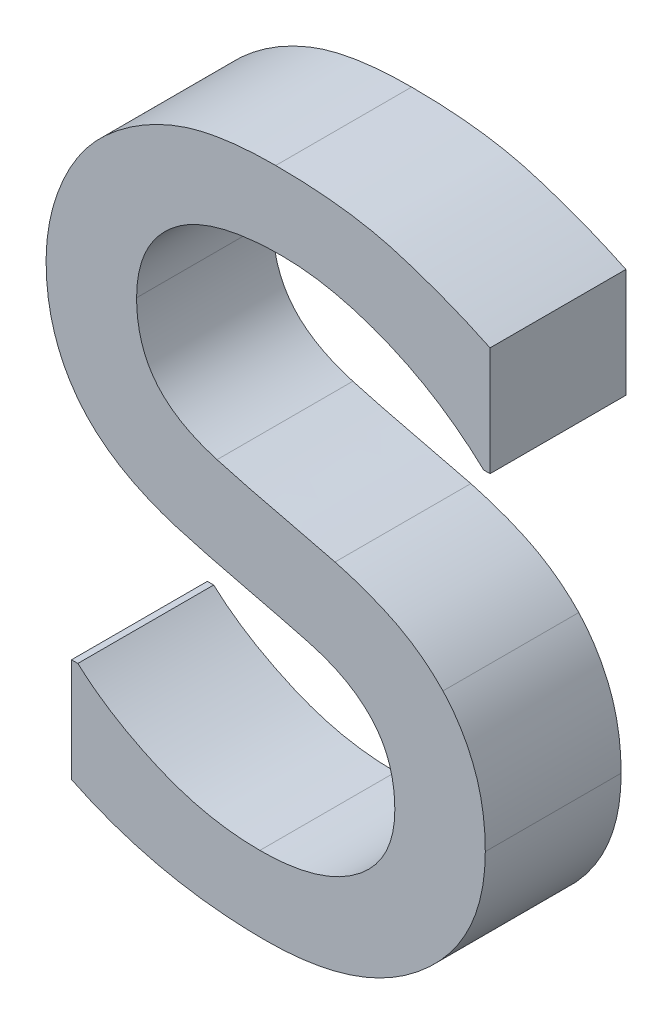
ISO-10303-21;
HEADER;
FILE_DESCRIPTION(('STEP AP214'),'2;1');
FILE_NAME('part.step','',(''),(''),'','','');
FILE_SCHEMA(('AUTOMOTIVE_DESIGN { 1 0 10303 214 1 1 1 1 }'));
ENDSEC;
DATA;
#1=APPLICATION_CONTEXT('core data for automotive mechanical design processes');
#2=APPLICATION_PROTOCOL_DEFINITION('international standard','automotive_design',2000,#1);
#3=PRODUCT_CONTEXT('',#1,'mechanical');
#4=PRODUCT('Part','Part','',(#3));
#5=PRODUCT_RELATED_PRODUCT_CATEGORY('part','',(#4));
#6=PRODUCT_DEFINITION_FORMATION('','',#4);
#7=PRODUCT_DEFINITION_CONTEXT('part definition',#1,'design');
#8=PRODUCT_DEFINITION('design','',#6,#7);
#9=PRODUCT_DEFINITION_SHAPE('','',#8);
#10=(LENGTH_UNIT() NAMED_UNIT(*) SI_UNIT(.MILLI.,.METRE.));
#11=(NAMED_UNIT(*) PLANE_ANGLE_UNIT() SI_UNIT($,.RADIAN.));
#12=(NAMED_UNIT(*) SI_UNIT($,.STERADIAN.) SOLID_ANGLE_UNIT());
#13=UNCERTAINTY_MEASURE_WITH_UNIT(LENGTH_MEASURE(1.E-05),#10,'distance_accuracy_value','');
#14=(GEOMETRIC_REPRESENTATION_CONTEXT(3) GLOBAL_UNCERTAINTY_ASSIGNED_CONTEXT((#13)) GLOBAL_UNIT_ASSIGNED_CONTEXT((#10,
#11,#12)) REPRESENTATION_CONTEXT('',''));
#15=CARTESIAN_POINT('',(0.,0.,0.));
#16=DIRECTION('',(0.,0.,1.));
#17=DIRECTION('',(1.,0.,0.));
#18=AXIS2_PLACEMENT_3D('',#15,#16,#17);
#19=CARTESIAN_POINT('',(-5.252091229778,-7.615979049479,0.));
#20=DIRECTION('',(1.,0.,0.));
#21=DIRECTION('',(0.,1.,0.));
#22=AXIS2_PLACEMENT_3D('',#19,#20,#21);
#23=PLANE('',#22);
#24=DIRECTION('',(0.,-1.,0.));
#25=VECTOR('',#24,1.);
#26=CARTESIAN_POINT('',(-5.252091229778,-7.535727648343,0.));
#27=LINE('',#26,#25);
#28=CARTESIAN_POINT('',(-5.252091229778,-7.535727648343,0.));
#29=VERTEX_POINT('',#28);
#30=CARTESIAN_POINT('',(-5.252091229778,-7.615979049479,0.));
#31=VERTEX_POINT('',#30);
#32=EDGE_CURVE('E11',#29,#31,#27,.T.);
#33=ORIENTED_EDGE('',*,*,#32,.F.);
#34=DIRECTION('',(0.,0.,1.));
#35=VECTOR('',#34,1.);
#36=CARTESIAN_POINT('',(-5.252091229778,-7.535727648343,0.));
#37=LINE('',#36,#35);
#38=CARTESIAN_POINT('',(-5.252091229778,-7.535727648343,0.1));
#39=VERTEX_POINT('',#38);
#40=EDGE_CURVE('E24',#29,#39,#37,.T.);
#41=ORIENTED_EDGE('',*,*,#40,.T.);
#42=DIRECTION('',(0.,1.,0.));
#43=VECTOR('',#42,1.);
#44=CARTESIAN_POINT('',(-5.252091229778,-7.535727648343,0.1));
#45=LINE('',#44,#43);
#46=CARTESIAN_POINT('',(-5.252091229778,-7.615979049479,0.1));
#47=VERTEX_POINT('',#46);
#48=EDGE_CURVE('E172',#47,#39,#45,.T.);
#49=ORIENTED_EDGE('',*,*,#48,.F.);
#50=DIRECTION('',(0.,0.,1.));
#51=VECTOR('',#50,1.);
#52=CARTESIAN_POINT('',(-5.252091229778,-7.615979049479,0.));
#53=LINE('',#52,#51);
#54=EDGE_CURVE('E469',#31,#47,#53,.T.);
#55=ORIENTED_EDGE('',*,*,#54,.F.);
#56=EDGE_LOOP('',(#33,#41,#49,#55));
#57=FACE_BOUND('',#56,.T.);
#58=ADVANCED_FACE('F17',(#57),#23,.T.);
#59=CARTESIAN_POINT('',(-5.256766068679,-7.615979049479,0.));
#60=DIRECTION('',(0.,-1.,0.));
#61=DIRECTION('',(1.,0.,0.));
#62=AXIS2_PLACEMENT_3D('',#59,#60,#61);
#63=PLANE('',#62);
#64=DIRECTION('',(-1.,0.,0.));
#65=VECTOR('',#64,1.);
#66=CARTESIAN_POINT('',(-5.252091229778,-7.615979049479,0.));
#67=LINE('',#66,#65);
#68=CARTESIAN_POINT('',(-5.256766068679,-7.615979049479,0.));
#69=VERTEX_POINT('',#68);
#70=EDGE_CURVE('E467',#31,#69,#67,.T.);
#71=ORIENTED_EDGE('',*,*,#70,.F.);
#72=ORIENTED_EDGE('',*,*,#54,.T.);
#73=DIRECTION('',(1.,0.,0.));
#74=VECTOR('',#73,1.);
#75=CARTESIAN_POINT('',(-5.252091229778,-7.615979049479,0.1));
#76=LINE('',#75,#74);
#77=CARTESIAN_POINT('',(-5.256766068679,-7.615979049479,0.1));
#78=VERTEX_POINT('',#77);
#79=EDGE_CURVE('E465',#78,#47,#76,.T.);
#80=ORIENTED_EDGE('',*,*,#79,.F.);
#81=DIRECTION('',(0.,0.,1.));
#82=VECTOR('',#81,1.);
#83=CARTESIAN_POINT('',(-5.256766068679,-7.615979049479,0.));
#84=LINE('',#83,#82);
#85=EDGE_CURVE('E459',#69,#78,#84,.T.);
#86=ORIENTED_EDGE('',*,*,#85,.F.);
#87=EDGE_LOOP('',(#71,#72,#80,#86));
#88=FACE_BOUND('',#87,.T.);
#89=ADVANCED_FACE('F539',(#88),#63,.T.);
#90=CARTESIAN_POINT('',(-5.405192203791,-7.553647864131,0.));
#91=CARTESIAN_POINT('',(-5.405192203791,-7.553647864131,0.1));
#92=CARTESIAN_POINT('',(-5.36818306249,-7.553647864131,0.));
#93=CARTESIAN_POINT('',(-5.36818306249,-7.553647864131,0.1));
#94=CARTESIAN_POINT('',(-5.288321231262,-7.586371736439,0.));
#95=CARTESIAN_POINT('',(-5.288321231262,-7.586371736439,0.1));
#96=CARTESIAN_POINT('',(-5.256766068679,-7.615979049479,0.));
#97=CARTESIAN_POINT('',(-5.256766068679,-7.615979049479,0.1));
#98=B_SPLINE_SURFACE_WITH_KNOTS('',2,1,((#90,#91),(#92,#93),(#94,#95),(#96,#97)),.UNSPECIFIED.,
.F.,.F.,.F.,(3,1,3),(2,2),(-2.,-1.,0.),(0.,0.01),.UNSPECIFIED.);
#99=CARTESIAN_POINT('',(-5.256766068679,-7.615979049479,0.));
#100=CARTESIAN_POINT('',(-5.288321231262,-7.586371736439,0.));
#101=CARTESIAN_POINT('',(-5.36818306249,-7.553647864131,0.));
#102=CARTESIAN_POINT('',(-5.405192203791,-7.553647864131,0.));
#103=B_SPLINE_CURVE_WITH_KNOTS('',2,(#99,#100,#101,#102),.UNSPECIFIED.,.F.,.F.,(3,1,3),(0.,1.,
2.),.UNSPECIFIED.);
#104=CARTESIAN_POINT('',(-5.405192203791,-7.553647864131,0.));
#105=VERTEX_POINT('',#104);
#106=EDGE_CURVE('E452',#69,#105,#103,.T.);
#107=CARTESIAN_POINT('',(-5.405192203791,-7.553647864131,0.1));
#108=CARTESIAN_POINT('',(-5.36818306249,-7.553647864131,0.1));
#109=CARTESIAN_POINT('',(-5.288321231262,-7.586371736439,0.1));
#110=CARTESIAN_POINT('',(-5.256766068679,-7.615979049479,0.1));
#111=B_SPLINE_CURVE_WITH_KNOTS('',2,(#107,#108,#109,#110),.UNSPECIFIED.,.F.,.F.,(3,1,3),(-2.,
-1.,0.),.UNSPECIFIED.);
#112=CARTESIAN_POINT('',(-5.405192203791,-7.553647864131,0.1));
#113=VERTEX_POINT('',#112);
#114=EDGE_CURVE('E447',#113,#78,#111,.T.);
#115=DIRECTION('',(0.,0.,1.));
#116=VECTOR('',#115,1.);
#117=CARTESIAN_POINT('',(-5.405192203791,-7.553647864131,0.));
#118=LINE('',#117,#116);
#119=EDGE_CURVE('E441',#105,#113,#118,.T.);
#120=ORIENTED_EDGE('',*,*,#106,.F.);
#121=ORIENTED_EDGE('',*,*,#85,.T.);
#122=ORIENTED_EDGE('',*,*,#114,.F.);
#123=ORIENTED_EDGE('',*,*,#119,.F.);
#124=EDGE_LOOP('',(#120,#121,#122,#123));
#125=FACE_BOUND('',#124,.T.);
#126=ADVANCED_FACE('F535',(#125),#98,.T.);
#127=CARTESIAN_POINT('',(-5.512323928609,-7.633899265267,0.));
#128=CARTESIAN_POINT('',(-5.512323928609,-7.633899265267,0.1));
#129=CARTESIAN_POINT('',(-5.512323928609,-7.597669263783,0.));
#130=CARTESIAN_POINT('',(-5.512323928609,-7.597669263783,0.1));
#131=CARTESIAN_POINT('',(-5.458173711337,-7.553647864131,0.));
#132=CARTESIAN_POINT('',(-5.458173711337,-7.553647864131,0.1));
#133=CARTESIAN_POINT('',(-5.405192203791,-7.553647864131,0.));
#134=CARTESIAN_POINT('',(-5.405192203791,-7.553647864131,0.1));
#135=B_SPLINE_SURFACE_WITH_KNOTS('',2,1,((#127,#128),(#129,#130),(#131,#132),(#133,#134)),
.UNSPECIFIED.,.F.,.F.,.F.,(3,1,3),(2,2),(-2.,-1.,0.),(0.,0.01),.UNSPECIFIED.);
#136=CARTESIAN_POINT('',(-5.405192203791,-7.553647864131,0.));
#137=CARTESIAN_POINT('',(-5.458173711337,-7.553647864131,0.));
#138=CARTESIAN_POINT('',(-5.512323928609,-7.597669263783,0.));
#139=CARTESIAN_POINT('',(-5.512323928609,-7.633899265267,0.));
#140=B_SPLINE_CURVE_WITH_KNOTS('',2,(#136,#137,#138,#139),.UNSPECIFIED.,.F.,.F.,(3,1,3),(0.,1.,
2.),.UNSPECIFIED.);
#141=CARTESIAN_POINT('',(-5.512323928609,-7.633899265267,0.));
#142=VERTEX_POINT('',#141);
#143=EDGE_CURVE('E434',#105,#142,#140,.T.);
#144=CARTESIAN_POINT('',(-5.512323928609,-7.633899265267,0.1));
#145=CARTESIAN_POINT('',(-5.512323928609,-7.597669263783,0.1));
#146=CARTESIAN_POINT('',(-5.458173711337,-7.553647864131,0.1));
#147=CARTESIAN_POINT('',(-5.405192203791,-7.553647864131,0.1));
#148=B_SPLINE_CURVE_WITH_KNOTS('',2,(#144,#145,#146,#147),.UNSPECIFIED.,.F.,.F.,(3,1,3),(-2.,
-1.,0.),.UNSPECIFIED.);
#149=CARTESIAN_POINT('',(-5.512323928609,-7.633899265267,0.1));
#150=VERTEX_POINT('',#149);
#151=EDGE_CURVE('E429',#150,#113,#148,.T.);
#152=DIRECTION('',(0.,0.,1.));
#153=VECTOR('',#152,1.);
#154=CARTESIAN_POINT('',(-5.512323928609,-7.633899265267,0.));
#155=LINE('',#154,#153);
#156=EDGE_CURVE('E423',#142,#150,#155,.T.);
#157=ORIENTED_EDGE('',*,*,#143,.F.);
#158=ORIENTED_EDGE('',*,*,#119,.T.);
#159=ORIENTED_EDGE('',*,*,#151,.F.);
#160=ORIENTED_EDGE('',*,*,#156,.F.);
#161=EDGE_LOOP('',(#157,#158,#159,#160));
#162=FACE_BOUND('',#161,.T.);
#163=ADVANCED_FACE('F531',(#162),#135,.T.);
#164=CARTESIAN_POINT('',(-5.453109302527,-7.70752797796,0.));
#165=CARTESIAN_POINT('',(-5.453109302527,-7.70752797796,0.1));
#166=CARTESIAN_POINT('',(-5.483885325293,-7.698567870066,0.));
#167=CARTESIAN_POINT('',(-5.483885325293,-7.698567870066,0.1));
#168=CARTESIAN_POINT('',(-5.512323928609,-7.662727438491,0.));
#169=CARTESIAN_POINT('',(-5.512323928609,-7.662727438491,0.1));
#170=CARTESIAN_POINT('',(-5.512323928609,-7.633899265267,0.));
#171=CARTESIAN_POINT('',(-5.512323928609,-7.633899265267,0.1));
#172=B_SPLINE_SURFACE_WITH_KNOTS('',2,1,((#164,#165),(#166,#167),(#168,#169),(#170,#171)),
.UNSPECIFIED.,.F.,.F.,.F.,(3,1,3),(2,2),(-2.,-1.,0.),(0.,0.01),.UNSPECIFIED.);
#173=CARTESIAN_POINT('',(-5.512323928609,-7.633899265267,0.));
#174=CARTESIAN_POINT('',(-5.512323928609,-7.662727438491,0.));
#175=CARTESIAN_POINT('',(-5.483885325293,-7.698567870066,0.));
#176=CARTESIAN_POINT('',(-5.453109302527,-7.70752797796,0.));
#177=B_SPLINE_CURVE_WITH_KNOTS('',2,(#173,#174,#175,#176),.UNSPECIFIED.,.F.,.F.,(3,1,3),(0.,1.,
2.),.UNSPECIFIED.);
#178=CARTESIAN_POINT('',(-5.453109302527,-7.70752797796,0.));
#179=VERTEX_POINT('',#178);
#180=EDGE_CURVE('E416',#142,#179,#177,.T.);
#181=CARTESIAN_POINT('',(-5.453109302527,-7.70752797796,0.1));
#182=CARTESIAN_POINT('',(-5.483885325293,-7.698567870066,0.1));
#183=CARTESIAN_POINT('',(-5.512323928609,-7.662727438491,0.1));
#184=CARTESIAN_POINT('',(-5.512323928609,-7.633899265267,0.1));
#185=B_SPLINE_CURVE_WITH_KNOTS('',2,(#181,#182,#183,#184),.UNSPECIFIED.,.F.,.F.,(3,1,3),(-2.,
-1.,0.),.UNSPECIFIED.);
#186=CARTESIAN_POINT('',(-5.453109302527,-7.70752797796,0.1));
#187=VERTEX_POINT('',#186);
#188=EDGE_CURVE('E411',#187,#150,#185,.T.);
#189=DIRECTION('',(0.,0.,1.));
#190=VECTOR('',#189,1.);
#191=CARTESIAN_POINT('',(-5.453109302527,-7.70752797796,0.));
#192=LINE('',#191,#190);
#193=EDGE_CURVE('E405',#179,#187,#192,.T.);
#194=ORIENTED_EDGE('',*,*,#180,.F.);
#195=ORIENTED_EDGE('',*,*,#156,.T.);
#196=ORIENTED_EDGE('',*,*,#188,.F.);
#197=ORIENTED_EDGE('',*,*,#193,.F.);
#198=EDGE_LOOP('',(#194,#195,#196,#197));
#199=FACE_BOUND('',#198,.T.);
#200=ADVANCED_FACE('F527',(#199),#172,.T.);
#201=CARTESIAN_POINT('',(-5.366235212948,-7.729343892832,0.));
#202=CARTESIAN_POINT('',(-5.366235212948,-7.729343892832,0.1));
#203=CARTESIAN_POINT('',(-5.393894676446,-7.72233163448,0.));
#204=CARTESIAN_POINT('',(-5.393894676446,-7.72233163448,0.1));
#205=CARTESIAN_POINT('',(-5.430903817747,-7.713761096495,0.));
#206=CARTESIAN_POINT('',(-5.430903817747,-7.713761096495,0.1));
#207=CARTESIAN_POINT('',(-5.453109302527,-7.70752797796,0.));
#208=CARTESIAN_POINT('',(-5.453109302527,-7.70752797796,0.1));
#209=B_SPLINE_SURFACE_WITH_KNOTS('',2,1,((#201,#202),(#203,#204),(#205,#206),(#207,#208)),
.UNSPECIFIED.,.F.,.F.,.F.,(3,1,3),(2,2),(-2.,-1.,0.),(0.,0.01),.UNSPECIFIED.);
#210=CARTESIAN_POINT('',(-5.453109302527,-7.70752797796,0.));
#211=CARTESIAN_POINT('',(-5.430903817747,-7.713761096495,0.));
#212=CARTESIAN_POINT('',(-5.393894676446,-7.72233163448,0.));
#213=CARTESIAN_POINT('',(-5.366235212948,-7.729343892832,0.));
#214=B_SPLINE_CURVE_WITH_KNOTS('',2,(#210,#211,#212,#213),.UNSPECIFIED.,.F.,.F.,(3,1,3),(0.,1.,
2.),.UNSPECIFIED.);
#215=CARTESIAN_POINT('',(-5.366235212948,-7.729343892832,0.));
#216=VERTEX_POINT('',#215);
#217=EDGE_CURVE('E398',#179,#216,#214,.T.);
#218=CARTESIAN_POINT('',(-5.366235212948,-7.729343892832,0.1));
#219=CARTESIAN_POINT('',(-5.393894676446,-7.72233163448,0.1));
#220=CARTESIAN_POINT('',(-5.430903817747,-7.713761096495,0.1));
#221=CARTESIAN_POINT('',(-5.453109302527,-7.70752797796,0.1));
#222=B_SPLINE_CURVE_WITH_KNOTS('',2,(#218,#219,#220,#221),.UNSPECIFIED.,.F.,.F.,(3,1,3),(-2.,
-1.,0.),.UNSPECIFIED.);
#223=CARTESIAN_POINT('',(-5.366235212948,-7.729343892832,0.1));
#224=VERTEX_POINT('',#223);
#225=EDGE_CURVE('E393',#224,#187,#222,.T.);
#226=DIRECTION('',(0.,0.,1.));
#227=VECTOR('',#226,1.);
#228=CARTESIAN_POINT('',(-5.366235212948,-7.729343892832,0.));
#229=LINE('',#228,#227);
#230=EDGE_CURVE('E387',#216,#224,#229,.T.);
#231=ORIENTED_EDGE('',*,*,#217,.F.);
#232=ORIENTED_EDGE('',*,*,#193,.T.);
#233=ORIENTED_EDGE('',*,*,#225,.F.);
#234=ORIENTED_EDGE('',*,*,#230,.F.);
#235=EDGE_LOOP('',(#231,#232,#233,#234));
#236=FACE_BOUND('',#235,.T.);
#237=ADVANCED_FACE('F523',(#236),#209,.T.);
#238=CARTESIAN_POINT('',(-5.286762951628,-7.771807012851,0.));
#239=CARTESIAN_POINT('',(-5.286762951628,-7.771807012851,0.1));
#240=CARTESIAN_POINT('',(-5.301956178057,-7.755834646605,0.));
#241=CARTESIAN_POINT('',(-5.301956178057,-7.755834646605,0.1));
#242=CARTESIAN_POINT('',(-5.341302738808,-7.735966581275,0.));
#243=CARTESIAN_POINT('',(-5.341302738808,-7.735966581275,0.1));
#244=CARTESIAN_POINT('',(-5.366235212948,-7.729343892832,0.));
#245=CARTESIAN_POINT('',(-5.366235212948,-7.729343892832,0.1));
#246=B_SPLINE_SURFACE_WITH_KNOTS('',2,1,((#238,#239),(#240,#241),(#242,#243),(#244,#245)),
.UNSPECIFIED.,.F.,.F.,.F.,(3,1,3),(2,2),(-2.,-1.,0.),(0.,0.01),.UNSPECIFIED.);
#247=CARTESIAN_POINT('',(-5.366235212948,-7.729343892832,0.));
#248=CARTESIAN_POINT('',(-5.341302738808,-7.735966581275,0.));
#249=CARTESIAN_POINT('',(-5.301956178057,-7.755834646605,0.));
#250=CARTESIAN_POINT('',(-5.286762951628,-7.771807012851,0.));
#251=B_SPLINE_CURVE_WITH_KNOTS('',2,(#247,#248,#249,#250),.UNSPECIFIED.,.F.,.F.,(3,1,3),(0.,1.,
2.),.UNSPECIFIED.);
#252=CARTESIAN_POINT('',(-5.286762951628,-7.771807012851,0.));
#253=VERTEX_POINT('',#252);
#254=EDGE_CURVE('E380',#216,#253,#251,.T.);
#255=CARTESIAN_POINT('',(-5.286762951628,-7.771807012851,0.1));
#256=CARTESIAN_POINT('',(-5.301956178057,-7.755834646605,0.1));
#257=CARTESIAN_POINT('',(-5.341302738808,-7.735966581275,0.1));
#258=CARTESIAN_POINT('',(-5.366235212948,-7.729343892832,0.1));
#259=B_SPLINE_CURVE_WITH_KNOTS('',2,(#255,#256,#257,#258),.UNSPECIFIED.,.F.,.F.,(3,1,3),(-2.,
-1.,0.),.UNSPECIFIED.);
#260=CARTESIAN_POINT('',(-5.286762951628,-7.771807012851,0.1));
#261=VERTEX_POINT('',#260);
#262=EDGE_CURVE('E375',#261,#224,#259,.T.);
#263=DIRECTION('',(0.,0.,1.));
#264=VECTOR('',#263,1.);
#265=CARTESIAN_POINT('',(-5.286762951628,-7.771807012851,0.));
#266=LINE('',#265,#264);
#267=EDGE_CURVE('E369',#253,#261,#266,.T.);
#268=ORIENTED_EDGE('',*,*,#254,.F.);
#269=ORIENTED_EDGE('',*,*,#230,.T.);
#270=ORIENTED_EDGE('',*,*,#262,.F.);
#271=ORIENTED_EDGE('',*,*,#267,.F.);
#272=EDGE_LOOP('',(#268,#269,#270,#271));
#273=FACE_BOUND('',#272,.T.);
#274=ADVANCED_FACE('F519',(#273),#246,.T.);
#275=CARTESIAN_POINT('',(-5.255597358954,-7.858681102431,0.));
#276=CARTESIAN_POINT('',(-5.255597358954,-7.858681102431,0.1));
#277=CARTESIAN_POINT('',(-5.255597358954,-7.830632069024,0.));
#278=CARTESIAN_POINT('',(-5.255597358954,-7.830632069024,0.1));
#279=CARTESIAN_POINT('',(-5.271959295108,-7.787779379096,0.));
#280=CARTESIAN_POINT('',(-5.271959295108,-7.787779379096,0.1));
#281=CARTESIAN_POINT('',(-5.286762951628,-7.771807012851,0.));
#282=CARTESIAN_POINT('',(-5.286762951628,-7.771807012851,0.1));
#283=B_SPLINE_SURFACE_WITH_KNOTS('',2,1,((#275,#276),(#277,#278),(#279,#280),(#281,#282)),
.UNSPECIFIED.,.F.,.F.,.F.,(3,1,3),(2,2),(-2.,-1.,0.),(0.,0.01),.UNSPECIFIED.);
#284=CARTESIAN_POINT('',(-5.286762951628,-7.771807012851,0.));
#285=CARTESIAN_POINT('',(-5.271959295108,-7.787779379096,0.));
#286=CARTESIAN_POINT('',(-5.255597358954,-7.830632069024,0.));
#287=CARTESIAN_POINT('',(-5.255597358954,-7.858681102431,0.));
#288=B_SPLINE_CURVE_WITH_KNOTS('',2,(#284,#285,#286,#287),.UNSPECIFIED.,.F.,.F.,(3,1,3),(0.,1.,
2.),.UNSPECIFIED.);
#289=CARTESIAN_POINT('',(-5.255597358954,-7.858681102431,0.));
#290=VERTEX_POINT('',#289);
#291=EDGE_CURVE('E362',#253,#290,#288,.T.);
#292=CARTESIAN_POINT('',(-5.255597358954,-7.858681102431,0.1));
#293=CARTESIAN_POINT('',(-5.255597358954,-7.830632069024,0.1));
#294=CARTESIAN_POINT('',(-5.271959295108,-7.787779379096,0.1));
#295=CARTESIAN_POINT('',(-5.286762951628,-7.771807012851,0.1));
#296=B_SPLINE_CURVE_WITH_KNOTS('',2,(#292,#293,#294,#295),.UNSPECIFIED.,.F.,.F.,(3,1,3),(-2.,
-1.,0.),.UNSPECIFIED.);
#297=CARTESIAN_POINT('',(-5.255597358954,-7.858681102431,0.1));
#298=VERTEX_POINT('',#297);
#299=EDGE_CURVE('E357',#298,#261,#296,.T.);
#300=DIRECTION('',(0.,0.,1.));
#301=VECTOR('',#300,1.);
#302=CARTESIAN_POINT('',(-5.255597358954,-7.858681102431,0.));
#303=LINE('',#302,#301);
#304=EDGE_CURVE('E351',#290,#298,#303,.T.);
#305=ORIENTED_EDGE('',*,*,#291,.F.);
#306=ORIENTED_EDGE('',*,*,#267,.T.);
#307=ORIENTED_EDGE('',*,*,#299,.F.);
#308=ORIENTED_EDGE('',*,*,#304,.F.);
#309=EDGE_LOOP('',(#305,#306,#307,#308));
#310=FACE_BOUND('',#309,.T.);
#311=ADVANCED_FACE('F515',(#310),#283,.T.);
#312=CARTESIAN_POINT('',(-5.417268870952,-7.996199280106,0.));
#313=CARTESIAN_POINT('',(-5.417268870952,-7.996199280106,0.1));
#314=CARTESIAN_POINT('',(-5.346756717526,-7.996199280106,0.));
#315=CARTESIAN_POINT('',(-5.346756717526,-7.996199280106,0.1));
#316=CARTESIAN_POINT('',(-5.255597358954,-7.917116588695,0.));
#317=CARTESIAN_POINT('',(-5.255597358954,-7.917116588695,0.1));
#318=CARTESIAN_POINT('',(-5.255597358954,-7.858681102431,0.));
#319=CARTESIAN_POINT('',(-5.255597358954,-7.858681102431,0.1));
#320=B_SPLINE_SURFACE_WITH_KNOTS('',2,1,((#312,#313),(#314,#315),(#316,#317),(#318,#319)),
.UNSPECIFIED.,.F.,.F.,.F.,(3,1,3),(2,2),(-2.,-1.,0.),(0.,0.01),.UNSPECIFIED.);
#321=CARTESIAN_POINT('',(-5.255597358954,-7.858681102431,0.));
#322=CARTESIAN_POINT('',(-5.255597358954,-7.917116588695,0.));
#323=CARTESIAN_POINT('',(-5.346756717526,-7.996199280106,0.));
#324=CARTESIAN_POINT('',(-5.417268870952,-7.996199280106,0.));
#325=B_SPLINE_CURVE_WITH_KNOTS('',2,(#321,#322,#323,#324),.UNSPECIFIED.,.F.,.F.,(3,1,3),(0.,1.,
2.),.UNSPECIFIED.);
#326=CARTESIAN_POINT('',(-5.417268870952,-7.996199280106,0.));
#327=VERTEX_POINT('',#326);
#328=EDGE_CURVE('E344',#290,#327,#325,.T.);
#329=CARTESIAN_POINT('',(-5.417268870952,-7.996199280106,0.1));
#330=CARTESIAN_POINT('',(-5.346756717526,-7.996199280106,0.1));
#331=CARTESIAN_POINT('',(-5.255597358954,-7.917116588695,0.1));
#332=CARTESIAN_POINT('',(-5.255597358954,-7.858681102431,0.1));
#333=B_SPLINE_CURVE_WITH_KNOTS('',2,(#329,#330,#331,#332),.UNSPECIFIED.,.F.,.F.,(3,1,3),(-2.,
-1.,0.),.UNSPECIFIED.);
#334=CARTESIAN_POINT('',(-5.417268870952,-7.996199280106,0.1));
#335=VERTEX_POINT('',#334);
#336=EDGE_CURVE('E339',#335,#298,#333,.T.);
#337=DIRECTION('',(0.,0.,1.));
#338=VECTOR('',#337,1.);
#339=CARTESIAN_POINT('',(-5.417268870952,-7.996199280106,0.));
#340=LINE('',#339,#338);
#341=EDGE_CURVE('E333',#327,#335,#340,.T.);
#342=ORIENTED_EDGE('',*,*,#328,.F.);
#343=ORIENTED_EDGE('',*,*,#304,.T.);
#344=ORIENTED_EDGE('',*,*,#336,.F.);
#345=ORIENTED_EDGE('',*,*,#341,.F.);
#346=EDGE_LOOP('',(#342,#343,#344,#345));
#347=FACE_BOUND('',#346,.T.);
#348=ADVANCED_FACE('F511',(#347),#320,.T.);
#349=CARTESIAN_POINT('',(-5.560241027345,-7.965033687432,0.));
#350=CARTESIAN_POINT('',(-5.560241027345,-7.965033687432,0.1));
#351=CARTESIAN_POINT('',(-5.52946500458,-7.98022691386,0.));
#352=CARTESIAN_POINT('',(-5.52946500458,-7.98022691386,0.1));
#353=CARTESIAN_POINT('',(-5.457784141429,-7.996199280106,0.));
#354=CARTESIAN_POINT('',(-5.457784141429,-7.996199280106,0.1));
#355=CARTESIAN_POINT('',(-5.417268870952,-7.996199280106,0.));
#356=CARTESIAN_POINT('',(-5.417268870952,-7.996199280106,0.1));
#357=B_SPLINE_SURFACE_WITH_KNOTS('',2,1,((#349,#350),(#351,#352),(#353,#354),(#355,#356)),
.UNSPECIFIED.,.F.,.F.,.F.,(3,1,3),(2,2),(-2.,-1.,0.),(0.,0.01),.UNSPECIFIED.);
#358=CARTESIAN_POINT('',(-5.417268870952,-7.996199280106,0.));
#359=CARTESIAN_POINT('',(-5.457784141429,-7.996199280106,0.));
#360=CARTESIAN_POINT('',(-5.52946500458,-7.98022691386,0.));
#361=CARTESIAN_POINT('',(-5.560241027345,-7.965033687432,0.));
#362=B_SPLINE_CURVE_WITH_KNOTS('',2,(#358,#359,#360,#361),.UNSPECIFIED.,.F.,.F.,(3,1,3),(0.,1.,
2.),.UNSPECIFIED.);
#363=CARTESIAN_POINT('',(-5.560241027345,-7.965033687432,0.));
#364=VERTEX_POINT('',#363);
#365=EDGE_CURVE('E326',#327,#364,#362,.T.);
#366=CARTESIAN_POINT('',(-5.560241027345,-7.965033687432,0.1));
#367=CARTESIAN_POINT('',(-5.52946500458,-7.98022691386,0.1));
#368=CARTESIAN_POINT('',(-5.457784141429,-7.996199280106,0.1));
#369=CARTESIAN_POINT('',(-5.417268870952,-7.996199280106,0.1));
#370=B_SPLINE_CURVE_WITH_KNOTS('',2,(#366,#367,#368,#369),.UNSPECIFIED.,.F.,.F.,(3,1,3),(-2.,
-1.,0.),.UNSPECIFIED.);
#371=CARTESIAN_POINT('',(-5.560241027345,-7.965033687432,0.1));
#372=VERTEX_POINT('',#371);
#373=EDGE_CURVE('E321',#372,#335,#370,.T.);
#374=DIRECTION('',(0.,0.,1.));
#375=VECTOR('',#374,1.);
#376=CARTESIAN_POINT('',(-5.560241027345,-7.965033687432,0.));
#377=LINE('',#376,#375);
#378=EDGE_CURVE('E318',#364,#372,#377,.T.);
#379=ORIENTED_EDGE('',*,*,#365,.F.);
#380=ORIENTED_EDGE('',*,*,#341,.T.);
#381=ORIENTED_EDGE('',*,*,#373,.F.);
#382=ORIENTED_EDGE('',*,*,#378,.F.);
#383=EDGE_LOOP('',(#379,#380,#381,#382));
#384=FACE_BOUND('',#383,.T.);
#385=ADVANCED_FACE('F507',(#384),#357,.T.);
#386=CARTESIAN_POINT('',(-5.560241027345,-7.88867798538,0.));
#387=DIRECTION('',(-1.,0.,0.));
#388=DIRECTION('',(0.,-1.,0.));
#389=AXIS2_PLACEMENT_3D('',#386,#387,#388);
#390=PLANE('',#389);
#391=DIRECTION('',(0.,1.,0.));
#392=VECTOR('',#391,1.);
#393=CARTESIAN_POINT('',(-5.560241027345,-7.965033687432,0.));
#394=LINE('',#393,#392);
#395=CARTESIAN_POINT('',(-5.560241027345,-7.88867798538,0.));
#396=VERTEX_POINT('',#395);
#397=EDGE_CURVE('E316',#364,#396,#394,.T.);
#398=ORIENTED_EDGE('',*,*,#397,.F.);
#399=ORIENTED_EDGE('',*,*,#378,.T.);
#400=DIRECTION('',(0.,-1.,0.));
#401=VECTOR('',#400,1.);
#402=CARTESIAN_POINT('',(-5.560241027345,-7.965033687432,0.1));
#403=LINE('',#402,#401);
#404=CARTESIAN_POINT('',(-5.560241027345,-7.88867798538,0.1));
#405=VERTEX_POINT('',#404);
#406=EDGE_CURVE('E313',#405,#372,#403,.T.);
#407=ORIENTED_EDGE('',*,*,#406,.F.);
#408=DIRECTION('',(0.,0.,1.));
#409=VECTOR('',#408,1.);
#410=CARTESIAN_POINT('',(-5.560241027345,-7.88867798538,0.));
#411=LINE('',#410,#409);
#412=EDGE_CURVE('E310',#396,#405,#411,.T.);
#413=ORIENTED_EDGE('',*,*,#412,.F.);
#414=EDGE_LOOP('',(#398,#399,#407,#413));
#415=FACE_BOUND('',#414,.T.);
#416=ADVANCED_FACE('F503',(#415),#390,.T.);
#417=CARTESIAN_POINT('',(-5.555566188444,-7.88867798538,0.));
#418=DIRECTION('',(0.,1.,0.));
#419=DIRECTION('',(-1.,0.,0.));
#420=AXIS2_PLACEMENT_3D('',#417,#418,#419);
#421=PLANE('',#420);
#422=DIRECTION('',(1.,0.,0.));
#423=VECTOR('',#422,1.);
#424=CARTESIAN_POINT('',(-5.560241027345,-7.88867798538,0.));
#425=LINE('',#424,#423);
#426=CARTESIAN_POINT('',(-5.555566188444,-7.88867798538,0.));
#427=VERTEX_POINT('',#426);
#428=EDGE_CURVE('E308',#396,#427,#425,.T.);
#429=ORIENTED_EDGE('',*,*,#428,.F.);
#430=ORIENTED_EDGE('',*,*,#412,.T.);
#431=DIRECTION('',(-1.,0.,0.));
#432=VECTOR('',#431,1.);
#433=CARTESIAN_POINT('',(-5.560241027345,-7.88867798538,0.1));
#434=LINE('',#433,#432);
#435=CARTESIAN_POINT('',(-5.555566188444,-7.88867798538,0.1));
#436=VERTEX_POINT('',#435);
#437=EDGE_CURVE('E305',#436,#405,#434,.T.);
#438=ORIENTED_EDGE('',*,*,#437,.F.);
#439=DIRECTION('',(0.,0.,1.));
#440=VECTOR('',#439,1.);
#441=CARTESIAN_POINT('',(-5.555566188444,-7.88867798538,0.));
#442=LINE('',#441,#440);
#443=EDGE_CURVE('E299',#427,#436,#442,.T.);
#444=ORIENTED_EDGE('',*,*,#443,.F.);
#445=EDGE_LOOP('',(#429,#430,#438,#444));
#446=FACE_BOUND('',#445,.T.);
#447=ADVANCED_FACE('F499',(#446),#421,.T.);
#448=CARTESIAN_POINT('',(-5.421554139945,-7.940880353109,0.));
#449=CARTESIAN_POINT('',(-5.421554139945,-7.940880353109,0.1));
#450=CARTESIAN_POINT('',(-5.460900700696,-7.940880353109,0.));
#451=CARTESIAN_POINT('',(-5.460900700696,-7.940880353109,0.1));
#452=CARTESIAN_POINT('',(-5.532581563847,-7.909714760435,0.));
#453=CARTESIAN_POINT('',(-5.532581563847,-7.909714760435,0.1));
#454=CARTESIAN_POINT('',(-5.555566188444,-7.88867798538,0.));
#455=CARTESIAN_POINT('',(-5.555566188444,-7.88867798538,0.1));
#456=B_SPLINE_SURFACE_WITH_KNOTS('',2,1,((#448,#449),(#450,#451),(#452,#453),(#454,#455)),
.UNSPECIFIED.,.F.,.F.,.F.,(3,1,3),(2,2),(-2.,-1.,0.),(0.,0.01),.UNSPECIFIED.);
#457=CARTESIAN_POINT('',(-5.555566188444,-7.88867798538,0.));
#458=CARTESIAN_POINT('',(-5.532581563847,-7.909714760435,0.));
#459=CARTESIAN_POINT('',(-5.460900700696,-7.940880353109,0.));
#460=CARTESIAN_POINT('',(-5.421554139945,-7.940880353109,0.));
#461=B_SPLINE_CURVE_WITH_KNOTS('',2,(#457,#458,#459,#460),.UNSPECIFIED.,.F.,.F.,(3,1,3),(0.,1.,
2.),.UNSPECIFIED.);
#462=CARTESIAN_POINT('',(-5.421554139945,-7.940880353109,0.));
#463=VERTEX_POINT('',#462);
#464=EDGE_CURVE('E292',#427,#463,#461,.T.);
#465=CARTESIAN_POINT('',(-5.421554139945,-7.940880353109,0.1));
#466=CARTESIAN_POINT('',(-5.460900700696,-7.940880353109,0.1));
#467=CARTESIAN_POINT('',(-5.532581563847,-7.909714760435,0.1));
#468=CARTESIAN_POINT('',(-5.555566188444,-7.88867798538,0.1));
#469=B_SPLINE_CURVE_WITH_KNOTS('',2,(#465,#466,#467,#468),.UNSPECIFIED.,.F.,.F.,(3,1,3),(-2.,
-1.,0.),.UNSPECIFIED.);
#470=CARTESIAN_POINT('',(-5.421554139945,-7.940880353109,0.1));
#471=VERTEX_POINT('',#470);
#472=EDGE_CURVE('E287',#471,#436,#469,.T.);
#473=DIRECTION('',(0.,0.,1.));
#474=VECTOR('',#473,1.);
#475=CARTESIAN_POINT('',(-5.421554139945,-7.940880353109,0.));
#476=LINE('',#475,#474);
#477=EDGE_CURVE('E281',#463,#471,#476,.T.);
#478=ORIENTED_EDGE('',*,*,#464,.F.);
#479=ORIENTED_EDGE('',*,*,#443,.T.);
#480=ORIENTED_EDGE('',*,*,#472,.F.);
#481=ORIENTED_EDGE('',*,*,#477,.F.);
#482=EDGE_LOOP('',(#478,#479,#480,#481));
#483=FACE_BOUND('',#482,.T.);
#484=ADVANCED_FACE('F495',(#483),#456,.T.);
#485=CARTESIAN_POINT('',(-5.322213813295,-7.865303790874,0.));
#486=CARTESIAN_POINT('',(-5.322213813295,-7.865303790874,0.1));
#487=CARTESIAN_POINT('',(-5.322213813295,-7.899196372907,0.));
#488=CARTESIAN_POINT('',(-5.322213813295,-7.899196372907,0.1));
#489=CARTESIAN_POINT('',(-5.377143170384,-7.940880353109,0.));
#490=CARTESIAN_POINT('',(-5.377143170384,-7.940880353109,0.1));
#491=CARTESIAN_POINT('',(-5.421554139945,-7.940880353109,0.));
#492=CARTESIAN_POINT('',(-5.421554139945,-7.940880353109,0.1));
#493=B_SPLINE_SURFACE_WITH_KNOTS('',2,1,((#485,#486),(#487,#488),(#489,#490),(#491,#492)),
.UNSPECIFIED.,.F.,.F.,.F.,(3,1,3),(2,2),(-2.,-1.,0.),(0.,0.01),.UNSPECIFIED.);
#494=CARTESIAN_POINT('',(-5.421554139945,-7.940880353109,0.));
#495=CARTESIAN_POINT('',(-5.377143170384,-7.940880353109,0.));
#496=CARTESIAN_POINT('',(-5.322213813295,-7.899196372907,0.));
#497=CARTESIAN_POINT('',(-5.322213813295,-7.865303790874,0.));
#498=B_SPLINE_CURVE_WITH_KNOTS('',2,(#494,#495,#496,#497),.UNSPECIFIED.,.F.,.F.,(3,1,3),(0.,1.,
2.),.UNSPECIFIED.);
#499=CARTESIAN_POINT('',(-5.322213813295,-7.865303790874,0.));
#500=VERTEX_POINT('',#499);
#501=EDGE_CURVE('E274',#463,#500,#498,.T.);
#502=CARTESIAN_POINT('',(-5.322213813295,-7.865303790874,0.1));
#503=CARTESIAN_POINT('',(-5.322213813295,-7.899196372907,0.1));
#504=CARTESIAN_POINT('',(-5.377143170384,-7.940880353109,0.1));
#505=CARTESIAN_POINT('',(-5.421554139945,-7.940880353109,0.1));
#506=B_SPLINE_CURVE_WITH_KNOTS('',2,(#502,#503,#504,#505),.UNSPECIFIED.,.F.,.F.,(3,1,3),(-2.,
-1.,0.),.UNSPECIFIED.);
#507=CARTESIAN_POINT('',(-5.322213813295,-7.865303790874,0.1));
#508=VERTEX_POINT('',#507);
#509=EDGE_CURVE('E269',#508,#471,#506,.T.);
#510=DIRECTION('',(0.,0.,1.));
#511=VECTOR('',#510,1.);
#512=CARTESIAN_POINT('',(-5.322213813295,-7.865303790874,0.));
#513=LINE('',#512,#511);
#514=EDGE_CURVE('E263',#500,#508,#513,.T.);
#515=ORIENTED_EDGE('',*,*,#501,.F.);
#516=ORIENTED_EDGE('',*,*,#477,.T.);
#517=ORIENTED_EDGE('',*,*,#509,.F.);
#518=ORIENTED_EDGE('',*,*,#514,.F.);
#519=EDGE_LOOP('',(#515,#516,#517,#518));
#520=FACE_BOUND('',#519,.T.);
#521=ADVANCED_FACE('F491',(#520),#493,.T.);
#522=CARTESIAN_POINT('',(-5.384934568552,-7.790506368455,0.));
#523=CARTESIAN_POINT('',(-5.384934568552,-7.790506368455,0.1));
#524=CARTESIAN_POINT('',(-5.354548115695,-7.798687336532,0.));
#525=CARTESIAN_POINT('',(-5.354548115695,-7.798687336532,0.1));
#526=CARTESIAN_POINT('',(-5.322213813295,-7.834917338016,0.));
#527=CARTESIAN_POINT('',(-5.322213813295,-7.834917338016,0.1));
#528=CARTESIAN_POINT('',(-5.322213813295,-7.865303790874,0.));
#529=CARTESIAN_POINT('',(-5.322213813295,-7.865303790874,0.1));
#530=B_SPLINE_SURFACE_WITH_KNOTS('',2,1,((#522,#523),(#524,#525),(#526,#527),(#528,#529)),
.UNSPECIFIED.,.F.,.F.,.F.,(3,1,3),(2,2),(-2.,-1.,0.),(0.,0.01),.UNSPECIFIED.);
#531=CARTESIAN_POINT('',(-5.322213813295,-7.865303790874,0.));
#532=CARTESIAN_POINT('',(-5.322213813295,-7.834917338016,0.));
#533=CARTESIAN_POINT('',(-5.354548115695,-7.798687336532,0.));
#534=CARTESIAN_POINT('',(-5.384934568552,-7.790506368455,0.));
#535=B_SPLINE_CURVE_WITH_KNOTS('',2,(#531,#532,#533,#534),.UNSPECIFIED.,.F.,.F.,(3,1,3),(0.,1.,
2.),.UNSPECIFIED.);
#536=CARTESIAN_POINT('',(-5.384934568552,-7.790506368455,0.));
#537=VERTEX_POINT('',#536);
#538=EDGE_CURVE('E256',#500,#537,#535,.T.);
#539=CARTESIAN_POINT('',(-5.384934568552,-7.790506368455,0.1));
#540=CARTESIAN_POINT('',(-5.354548115695,-7.798687336532,0.1));
#541=CARTESIAN_POINT('',(-5.322213813295,-7.834917338016,0.1));
#542=CARTESIAN_POINT('',(-5.322213813295,-7.865303790874,0.1));
#543=B_SPLINE_CURVE_WITH_KNOTS('',2,(#539,#540,#541,#542),.UNSPECIFIED.,.F.,.F.,(3,1,3),(-2.,
-1.,0.),.UNSPECIFIED.);
#544=CARTESIAN_POINT('',(-5.384934568552,-7.790506368455,0.1));
#545=VERTEX_POINT('',#544);
#546=EDGE_CURVE('E251',#545,#508,#543,.T.);
#547=DIRECTION('',(0.,0.,1.));
#548=VECTOR('',#547,1.);
#549=CARTESIAN_POINT('',(-5.384934568552,-7.790506368455,0.));
#550=LINE('',#549,#548);
#551=EDGE_CURVE('E245',#537,#545,#550,.T.);
#552=ORIENTED_EDGE('',*,*,#538,.F.);
#553=ORIENTED_EDGE('',*,*,#514,.T.);
#554=ORIENTED_EDGE('',*,*,#546,.F.);
#555=ORIENTED_EDGE('',*,*,#551,.F.);
#556=EDGE_LOOP('',(#552,#553,#554,#555));
#557=FACE_BOUND('',#556,.T.);
#558=ADVANCED_FACE('F487',(#557),#530,.T.);
#559=CARTESIAN_POINT('',(-5.483495755385,-7.765184324408,0.));
#560=CARTESIAN_POINT('',(-5.483495755385,-7.765184324408,0.1));
#561=CARTESIAN_POINT('',(-5.464017259963,-7.771027873034,0.));
#562=CARTESIAN_POINT('',(-5.464017259963,-7.771027873034,0.1));
#563=CARTESIAN_POINT('',(-5.405192203791,-7.785052389737,0.));
#564=CARTESIAN_POINT('',(-5.405192203791,-7.785052389737,0.1));
#565=CARTESIAN_POINT('',(-5.384934568552,-7.790506368455,0.));
#566=CARTESIAN_POINT('',(-5.384934568552,-7.790506368455,0.1));
#567=B_SPLINE_SURFACE_WITH_KNOTS('',2,1,((#559,#560),(#561,#562),(#563,#564),(#565,#566)),
.UNSPECIFIED.,.F.,.F.,.F.,(3,1,3),(2,2),(-2.,-1.,0.),(0.,0.01),.UNSPECIFIED.);
#568=CARTESIAN_POINT('',(-5.384934568552,-7.790506368455,0.));
#569=CARTESIAN_POINT('',(-5.405192203791,-7.785052389737,0.));
#570=CARTESIAN_POINT('',(-5.464017259963,-7.771027873034,0.));
#571=CARTESIAN_POINT('',(-5.483495755385,-7.765184324408,0.));
#572=B_SPLINE_CURVE_WITH_KNOTS('',2,(#568,#569,#570,#571),.UNSPECIFIED.,.F.,.F.,(3,1,3),(0.,1.,
2.),.UNSPECIFIED.);
#573=CARTESIAN_POINT('',(-5.483495755385,-7.765184324408,0.));
#574=VERTEX_POINT('',#573);
#575=EDGE_CURVE('E238',#537,#574,#572,.T.);
#576=CARTESIAN_POINT('',(-5.483495755385,-7.765184324408,0.1));
#577=CARTESIAN_POINT('',(-5.464017259963,-7.771027873034,0.1));
#578=CARTESIAN_POINT('',(-5.405192203791,-7.785052389737,0.1));
#579=CARTESIAN_POINT('',(-5.384934568552,-7.790506368455,0.1));
#580=B_SPLINE_CURVE_WITH_KNOTS('',2,(#576,#577,#578,#579),.UNSPECIFIED.,.F.,.F.,(3,1,3),(-2.,
-1.,0.),.UNSPECIFIED.);
#581=CARTESIAN_POINT('',(-5.483495755385,-7.765184324408,0.1));
#582=VERTEX_POINT('',#581);
#583=EDGE_CURVE('E233',#582,#545,#580,.T.);
#584=DIRECTION('',(0.,0.,1.));
#585=VECTOR('',#584,1.);
#586=CARTESIAN_POINT('',(-5.483495755385,-7.765184324408,0.));
#587=LINE('',#586,#585);
#588=EDGE_CURVE('E227',#574,#582,#587,.T.);
#589=ORIENTED_EDGE('',*,*,#575,.F.);
#590=ORIENTED_EDGE('',*,*,#551,.T.);
#591=ORIENTED_EDGE('',*,*,#583,.F.);
#592=ORIENTED_EDGE('',*,*,#588,.F.);
#593=EDGE_LOOP('',(#589,#590,#591,#592));
#594=FACE_BOUND('',#593,.T.);
#595=ADVANCED_FACE('F483',(#594),#567,.T.);
#596=CARTESIAN_POINT('',(-5.57894038295,-7.644028082886,0.));
#597=CARTESIAN_POINT('',(-5.57894038295,-7.644028082886,0.1));
#598=CARTESIAN_POINT('',(-5.57894038295,-7.688828622356,0.));
#599=CARTESIAN_POINT('',(-5.57894038295,-7.688828622356,0.1));
#600=CARTESIAN_POINT('',(-5.532971133755,-7.749991097979,0.));
#601=CARTESIAN_POINT('',(-5.532971133755,-7.749991097979,0.1));
#602=CARTESIAN_POINT('',(-5.483495755385,-7.765184324408,0.));
#603=CARTESIAN_POINT('',(-5.483495755385,-7.765184324408,0.1));
#604=B_SPLINE_SURFACE_WITH_KNOTS('',2,1,((#596,#597),(#598,#599),(#600,#601),(#602,#603)),
.UNSPECIFIED.,.F.,.F.,.F.,(3,1,3),(2,2),(-2.,-1.,0.),(0.,0.01),.UNSPECIFIED.);
#605=CARTESIAN_POINT('',(-5.483495755385,-7.765184324408,0.));
#606=CARTESIAN_POINT('',(-5.532971133755,-7.749991097979,0.));
#607=CARTESIAN_POINT('',(-5.57894038295,-7.688828622356,0.));
#608=CARTESIAN_POINT('',(-5.57894038295,-7.644028082886,0.));
#609=B_SPLINE_CURVE_WITH_KNOTS('',2,(#605,#606,#607,#608),.UNSPECIFIED.,.F.,.F.,(3,1,3),(0.,1.,
2.),.UNSPECIFIED.);
#610=CARTESIAN_POINT('',(-5.57894038295,-7.644028082886,0.));
#611=VERTEX_POINT('',#610);
#612=EDGE_CURVE('E220',#574,#611,#609,.T.);
#613=CARTESIAN_POINT('',(-5.57894038295,-7.644028082886,0.1));
#614=CARTESIAN_POINT('',(-5.57894038295,-7.688828622356,0.1));
#615=CARTESIAN_POINT('',(-5.532971133755,-7.749991097979,0.1));
#616=CARTESIAN_POINT('',(-5.483495755385,-7.765184324408,0.1));
#617=B_SPLINE_CURVE_WITH_KNOTS('',2,(#613,#614,#615,#616),.UNSPECIFIED.,.F.,.F.,(3,1,3),(-2.,
-1.,0.),.UNSPECIFIED.);
#618=CARTESIAN_POINT('',(-5.57894038295,-7.644028082886,0.1));
#619=VERTEX_POINT('',#618);
#620=EDGE_CURVE('E215',#619,#582,#617,.T.);
#621=DIRECTION('',(0.,0.,1.));
#622=VECTOR('',#621,1.);
#623=CARTESIAN_POINT('',(-5.57894038295,-7.644028082886,0.));
#624=LINE('',#623,#622);
#625=EDGE_CURVE('E209',#611,#619,#624,.T.);
#626=ORIENTED_EDGE('',*,*,#612,.F.);
#627=ORIENTED_EDGE('',*,*,#588,.T.);
#628=ORIENTED_EDGE('',*,*,#620,.F.);
#629=ORIENTED_EDGE('',*,*,#625,.F.);
#630=EDGE_LOOP('',(#626,#627,#628,#629));
#631=FACE_BOUND('',#630,.T.);
#632=ADVANCED_FACE('F479',(#631),#604,.T.);
#633=CARTESIAN_POINT('',(-5.535308553206,-7.541960766878,0.));
#634=CARTESIAN_POINT('',(-5.535308553206,-7.541960766878,0.1));
#635=CARTESIAN_POINT('',(-5.555955758353,-7.561049692391,0.));
#636=CARTESIAN_POINT('',(-5.555955758353,-7.561049692391,0.1));
#637=CARTESIAN_POINT('',(-5.57894038295,-7.615589479571,0.));
#638=CARTESIAN_POINT('',(-5.57894038295,-7.615589479571,0.1));
#639=CARTESIAN_POINT('',(-5.57894038295,-7.644028082886,0.));
#640=CARTESIAN_POINT('',(-5.57894038295,-7.644028082886,0.1));
#641=B_SPLINE_SURFACE_WITH_KNOTS('',2,1,((#633,#634),(#635,#636),(#637,#638),(#639,#640)),
.UNSPECIFIED.,.F.,.F.,.F.,(3,1,3),(2,2),(-2.,-1.,0.),(0.,0.01),.UNSPECIFIED.);
#642=CARTESIAN_POINT('',(-5.57894038295,-7.644028082886,0.));
#643=CARTESIAN_POINT('',(-5.57894038295,-7.615589479571,0.));
#644=CARTESIAN_POINT('',(-5.555955758353,-7.561049692391,0.));
#645=CARTESIAN_POINT('',(-5.535308553206,-7.541960766878,0.));
#646=B_SPLINE_CURVE_WITH_KNOTS('',2,(#642,#643,#644,#645),.UNSPECIFIED.,.F.,.F.,(3,1,3),(0.,1.,
2.),.UNSPECIFIED.);
#647=CARTESIAN_POINT('',(-5.535308553206,-7.541960766878,0.));
#648=VERTEX_POINT('',#647);
#649=EDGE_CURVE('E202',#611,#648,#646,.T.);
#650=CARTESIAN_POINT('',(-5.535308553206,-7.541960766878,0.1));
#651=CARTESIAN_POINT('',(-5.555955758353,-7.561049692391,0.1));
#652=CARTESIAN_POINT('',(-5.57894038295,-7.615589479571,0.1));
#653=CARTESIAN_POINT('',(-5.57894038295,-7.644028082886,0.1));
#654=B_SPLINE_CURVE_WITH_KNOTS('',2,(#650,#651,#652,#653),.UNSPECIFIED.,.F.,.F.,(3,1,3),(-2.,
-1.,0.),.UNSPECIFIED.);
#655=CARTESIAN_POINT('',(-5.535308553206,-7.541960766878,0.1));
#656=VERTEX_POINT('',#655);
#657=EDGE_CURVE('E198',#656,#619,#654,.T.);
#658=DIRECTION('',(0.,0.,1.));
#659=VECTOR('',#658,1.);
#660=CARTESIAN_POINT('',(-5.535308553206,-7.541960766878,0.));
#661=LINE('',#660,#659);
#662=EDGE_CURVE('E157',#648,#656,#661,.T.);
#663=ORIENTED_EDGE('',*,*,#649,.F.);
#664=ORIENTED_EDGE('',*,*,#625,.T.);
#665=ORIENTED_EDGE('',*,*,#657,.F.);
#666=ORIENTED_EDGE('',*,*,#662,.F.);
#667=EDGE_LOOP('',(#663,#664,#665,#666));
#668=FACE_BOUND('',#667,.T.);
#669=ADVANCED_FACE('F477',(#668),#641,.T.);
#670=CARTESIAN_POINT('',(-5.409867042692,-7.498328937134,0.));
#671=CARTESIAN_POINT('',(-5.409867042692,-7.498328937134,0.1));
#672=CARTESIAN_POINT('',(-5.453888442344,-7.498328937134,0.));
#673=CARTESIAN_POINT('',(-5.453888442344,-7.498328937134,0.1));
#674=CARTESIAN_POINT('',(-5.512323928609,-7.520923991823,0.));
#675=CARTESIAN_POINT('',(-5.512323928609,-7.520923991823,0.1));
#676=CARTESIAN_POINT('',(-5.535308553206,-7.541960766878,0.));
#677=CARTESIAN_POINT('',(-5.535308553206,-7.541960766878,0.1));
#678=B_SPLINE_SURFACE_WITH_KNOTS('',2,1,((#670,#671),(#672,#673),(#674,#675),(#676,#677)),
.UNSPECIFIED.,.F.,.F.,.F.,(3,1,3),(2,2),(-2.,-1.,0.),(0.,0.01),.UNSPECIFIED.);
#679=CARTESIAN_POINT('',(-5.535308553206,-7.541960766878,0.));
#680=CARTESIAN_POINT('',(-5.512323928609,-7.520923991823,0.));
#681=CARTESIAN_POINT('',(-5.453888442344,-7.498328937134,0.));
#682=CARTESIAN_POINT('',(-5.409867042692,-7.498328937134,0.));
#683=B_SPLINE_CURVE_WITH_KNOTS('',2,(#679,#680,#681,#682),.UNSPECIFIED.,.F.,.F.,(3,1,3),(0.,1.,
2.),.UNSPECIFIED.);
#684=CARTESIAN_POINT('',(-5.409867042692,-7.498328937134,0.));
#685=VERTEX_POINT('',#684);
#686=EDGE_CURVE('E161',#648,#685,#683,.T.);
#687=CARTESIAN_POINT('',(-5.409867042692,-7.498328937134,0.1));
#688=CARTESIAN_POINT('',(-5.453888442344,-7.498328937134,0.1));
#689=CARTESIAN_POINT('',(-5.512323928609,-7.520923991823,0.1));
#690=CARTESIAN_POINT('',(-5.535308553206,-7.541960766878,0.1));
#691=B_SPLINE_CURVE_WITH_KNOTS('',2,(#687,#688,#689,#690),.UNSPECIFIED.,.F.,.F.,(3,1,3),(-2.,
-1.,0.),.UNSPECIFIED.);
#692=CARTESIAN_POINT('',(-5.409867042692,-7.498328937134,0.1));
#693=VERTEX_POINT('',#692);
#694=EDGE_CURVE('E150',#693,#656,#691,.T.);
#695=DIRECTION('',(0.,0.,1.));
#696=VECTOR('',#695,1.);
#697=CARTESIAN_POINT('',(-5.409867042692,-7.498328937134,0.));
#698=LINE('',#697,#696);
#699=EDGE_CURVE('E154',#685,#693,#698,.T.);
#700=ORIENTED_EDGE('',*,*,#686,.F.);
#701=ORIENTED_EDGE('',*,*,#662,.T.);
#702=ORIENTED_EDGE('',*,*,#694,.F.);
#703=ORIENTED_EDGE('',*,*,#699,.F.);
#704=EDGE_LOOP('',(#700,#701,#702,#703));
#705=FACE_BOUND('',#704,.T.);
#706=ADVANCED_FACE('F153',(#705),#678,.T.);
#707=CARTESIAN_POINT('',(-5.252091229778,-7.535727648343,0.));
#708=CARTESIAN_POINT('',(-5.252091229778,-7.535727648343,0.1));
#709=CARTESIAN_POINT('',(-5.284425532178,-7.520144852006,0.));
#710=CARTESIAN_POINT('',(-5.284425532178,-7.520144852006,0.1));
#711=CARTESIAN_POINT('',(-5.357664674962,-7.498328937134,0.));
#712=CARTESIAN_POINT('',(-5.357664674962,-7.498328937134,0.1));
#713=CARTESIAN_POINT('',(-5.409867042692,-7.498328937134,0.));
#714=CARTESIAN_POINT('',(-5.409867042692,-7.498328937134,0.1));
#715=B_SPLINE_SURFACE_WITH_KNOTS('',2,1,((#707,#708),(#709,#710),(#711,#712),(#713,#714)),
.UNSPECIFIED.,.F.,.F.,.F.,(3,1,3),(2,2),(-2.,-1.,0.),(0.,0.01),.UNSPECIFIED.);
#716=CARTESIAN_POINT('',(-5.409867042692,-7.498328937134,0.));
#717=CARTESIAN_POINT('',(-5.357664674962,-7.498328937134,0.));
#718=CARTESIAN_POINT('',(-5.284425532178,-7.520144852006,0.));
#719=CARTESIAN_POINT('',(-5.252091229778,-7.535727648343,0.));
#720=B_SPLINE_CURVE_WITH_KNOTS('',2,(#716,#717,#718,#719),.UNSPECIFIED.,.F.,.F.,(3,1,3),(0.,1.,
2.),.UNSPECIFIED.);
#721=EDGE_CURVE('E167',#685,#29,#720,.T.);
#722=CARTESIAN_POINT('',(-5.252091229778,-7.535727648343,0.1));
#723=CARTESIAN_POINT('',(-5.284425532178,-7.520144852006,0.1));
#724=CARTESIAN_POINT('',(-5.357664674962,-7.498328937134,0.1));
#725=CARTESIAN_POINT('',(-5.409867042692,-7.498328937134,0.1));
#726=B_SPLINE_CURVE_WITH_KNOTS('',2,(#722,#723,#724,#725),.UNSPECIFIED.,.F.,.F.,(3,1,3),(-2.,
-1.,0.),.UNSPECIFIED.);
#727=EDGE_CURVE('E166',#39,#693,#726,.T.);
#728=ORIENTED_EDGE('',*,*,#721,.F.);
#729=ORIENTED_EDGE('',*,*,#699,.T.);
#730=ORIENTED_EDGE('',*,*,#727,.F.);
#731=ORIENTED_EDGE('',*,*,#40,.F.);
#732=EDGE_LOOP('',(#728,#729,#730,#731));
#733=FACE_BOUND('',#732,.T.);
#734=ADVANCED_FACE('F165',(#733),#715,.T.);
#735=CARTESIAN_POINT('',(-5.413013292217,-7.744032420566,0.));
#736=DIRECTION('',(0.,0.,1.));
#737=DIRECTION('',(1.,0.,0.));
#738=AXIS2_PLACEMENT_3D('',#735,#736,#737);
#739=PLANE('',#738);
#740=ORIENTED_EDGE('',*,*,#721,.T.);
#741=ORIENTED_EDGE('',*,*,#32,.T.);
#742=ORIENTED_EDGE('',*,*,#70,.T.);
#743=ORIENTED_EDGE('',*,*,#106,.T.);
#744=ORIENTED_EDGE('',*,*,#143,.T.);
#745=ORIENTED_EDGE('',*,*,#180,.T.);
#746=ORIENTED_EDGE('',*,*,#217,.T.);
#747=ORIENTED_EDGE('',*,*,#254,.T.);
#748=ORIENTED_EDGE('',*,*,#291,.T.);
#749=ORIENTED_EDGE('',*,*,#328,.T.);
#750=ORIENTED_EDGE('',*,*,#365,.T.);
#751=ORIENTED_EDGE('',*,*,#397,.T.);
#752=ORIENTED_EDGE('',*,*,#428,.T.);
#753=ORIENTED_EDGE('',*,*,#464,.T.);
#754=ORIENTED_EDGE('',*,*,#501,.T.);
#755=ORIENTED_EDGE('',*,*,#538,.T.);
#756=ORIENTED_EDGE('',*,*,#575,.T.);
#757=ORIENTED_EDGE('',*,*,#612,.T.);
#758=ORIENTED_EDGE('',*,*,#649,.T.);
#759=ORIENTED_EDGE('',*,*,#686,.T.);
#760=EDGE_LOOP('',(#740,#741,#742,#743,#744,#745,#746,#747,#748,#749,#750,#751,#752,#753,#754,
#755,#756,#757,#758,#759));
#761=FACE_BOUND('',#760,.T.);
#762=ADVANCED_FACE('F472',(#761),#739,.F.);
#763=CARTESIAN_POINT('',(-5.413013292217,-7.744032420566,0.1));
#764=DIRECTION('',(0.,0.,1.));
#765=DIRECTION('',(1.,0.,0.));
#766=AXIS2_PLACEMENT_3D('',#763,#764,#765);
#767=PLANE('',#766);
#768=ORIENTED_EDGE('',*,*,#727,.T.);
#769=ORIENTED_EDGE('',*,*,#694,.T.);
#770=ORIENTED_EDGE('',*,*,#657,.T.);
#771=ORIENTED_EDGE('',*,*,#620,.T.);
#772=ORIENTED_EDGE('',*,*,#583,.T.);
#773=ORIENTED_EDGE('',*,*,#546,.T.);
#774=ORIENTED_EDGE('',*,*,#509,.T.);
#775=ORIENTED_EDGE('',*,*,#472,.T.);
#776=ORIENTED_EDGE('',*,*,#437,.T.);
#777=ORIENTED_EDGE('',*,*,#406,.T.);
#778=ORIENTED_EDGE('',*,*,#373,.T.);
#779=ORIENTED_EDGE('',*,*,#336,.T.);
#780=ORIENTED_EDGE('',*,*,#299,.T.);
#781=ORIENTED_EDGE('',*,*,#262,.T.);
#782=ORIENTED_EDGE('',*,*,#225,.T.);
#783=ORIENTED_EDGE('',*,*,#188,.T.);
#784=ORIENTED_EDGE('',*,*,#151,.T.);
#785=ORIENTED_EDGE('',*,*,#114,.T.);
#786=ORIENTED_EDGE('',*,*,#79,.T.);
#787=ORIENTED_EDGE('',*,*,#48,.T.);
#788=EDGE_LOOP('',(#768,#769,#770,#771,#772,#773,#774,#775,#776,#777,#778,#779,#780,#781,#782,
#783,#784,#785,#786,#787));
#789=FACE_BOUND('',#788,.T.);
#790=ADVANCED_FACE('F170',(#789),#767,.T.);
#791=CLOSED_SHELL('',(#58,#89,#126,#163,#200,#237,#274,#311,#348,#385,#416,#447,#484,#521,#558,
#595,#632,#669,#706,#734,#762,#790));
#792=MANIFOLD_SOLID_BREP('B1',#791);
#793=ADVANCED_BREP_SHAPE_REPRESENTATION('',(#18,#792),#14);
#794=SHAPE_DEFINITION_REPRESENTATION(#9,#793);
ENDSEC;
END-ISO-10303-21;
